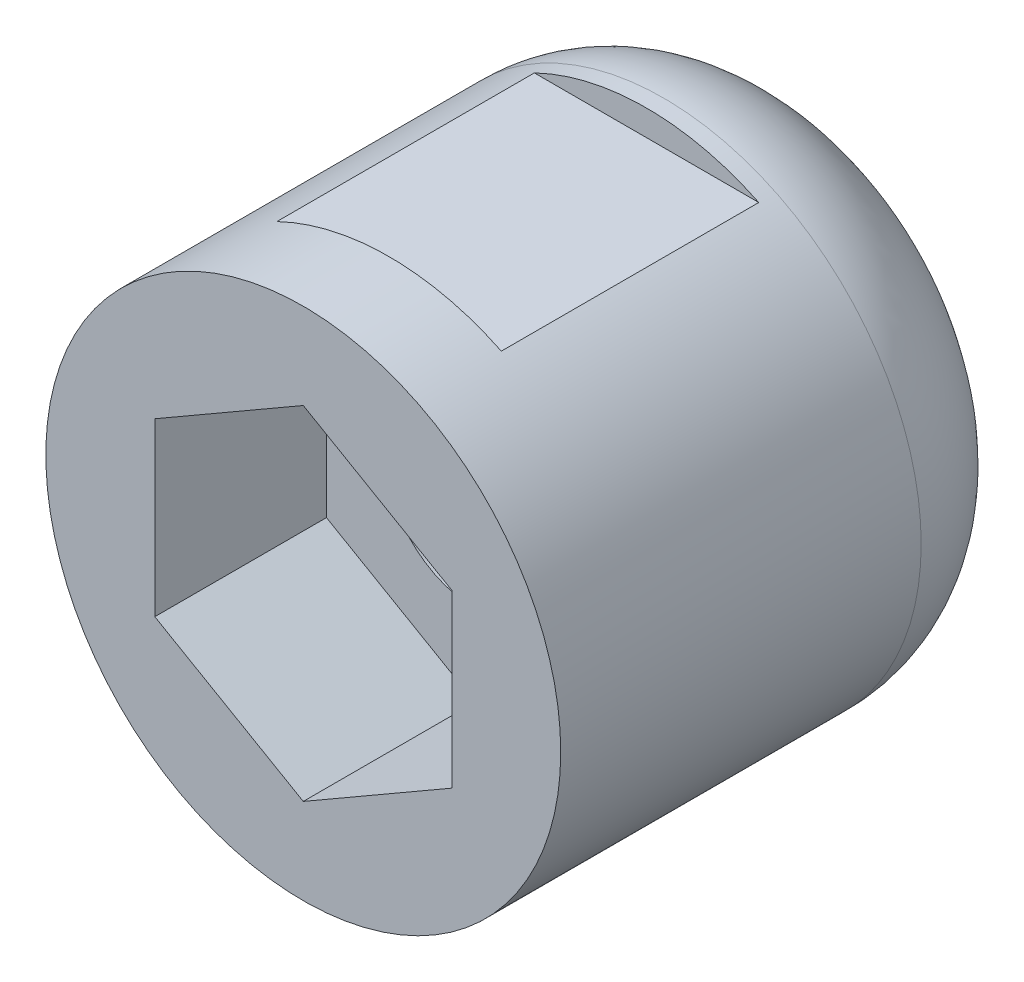
ISO-10303-21;
HEADER;
FILE_DESCRIPTION(('STEP AP214'),'2;1');
FILE_NAME('part.step','',(''),(''),'','','');
FILE_SCHEMA(('AUTOMOTIVE_DESIGN { 1 0 10303 214 1 1 1 1 }'));
ENDSEC;
DATA;
#1=APPLICATION_CONTEXT('core data for automotive mechanical design processes');
#2=APPLICATION_PROTOCOL_DEFINITION('international standard','automotive_design',2000,#1);
#3=PRODUCT_CONTEXT('',#1,'mechanical');
#4=PRODUCT('Part','Part','',(#3));
#5=PRODUCT_RELATED_PRODUCT_CATEGORY('part','',(#4));
#6=PRODUCT_DEFINITION_FORMATION('','',#4);
#7=PRODUCT_DEFINITION_CONTEXT('part definition',#1,'design');
#8=PRODUCT_DEFINITION('design','',#6,#7);
#9=PRODUCT_DEFINITION_SHAPE('','',#8);
#10=(LENGTH_UNIT() NAMED_UNIT(*) SI_UNIT(.MILLI.,.METRE.));
#11=(NAMED_UNIT(*) PLANE_ANGLE_UNIT() SI_UNIT($,.RADIAN.));
#12=(NAMED_UNIT(*) SI_UNIT($,.STERADIAN.) SOLID_ANGLE_UNIT());
#13=UNCERTAINTY_MEASURE_WITH_UNIT(LENGTH_MEASURE(1.E-05),#10,'distance_accuracy_value','');
#14=(GEOMETRIC_REPRESENTATION_CONTEXT(3) GLOBAL_UNCERTAINTY_ASSIGNED_CONTEXT((#13)) GLOBAL_UNIT_ASSIGNED_CONTEXT((#10,
#11,#12)) REPRESENTATION_CONTEXT('',''));
#15=CARTESIAN_POINT('',(0.,0.,0.));
#16=DIRECTION('',(0.,0.,1.));
#17=DIRECTION('',(1.,0.,0.));
#18=AXIS2_PLACEMENT_3D('',#15,#16,#17);
#19=CARTESIAN_POINT('',(0.,0.,14.5));
#20=DIRECTION('',(0.,0.,-1.));
#21=DIRECTION('',(-1.,0.,0.));
#22=AXIS2_PLACEMENT_3D('',#19,#20,#21);
#23=CYLINDRICAL_SURFACE('',#22,5.25);
#24=CARTESIAN_POINT('',(0.,0.,-14.5));
#25=DIRECTION('',(0.,0.,1.));
#26=DIRECTION('',(1.,0.,0.));
#27=AXIS2_PLACEMENT_3D('',#24,#25,#26);
#28=CIRCLE('',#27,5.25);
#29=CARTESIAN_POINT('',(-5.25,0.,-14.5));
#30=VERTEX_POINT('',#29);
#31=EDGE_CURVE('E202',#30,#30,#28,.T.);
#32=CARTESIAN_POINT('',(0.,0.,4.5));
#33=DIRECTION('',(0.,0.,1.));
#34=DIRECTION('',(1.,0.,0.));
#35=AXIS2_PLACEMENT_3D('',#32,#33,#34);
#36=CIRCLE('',#35,5.25);
#37=CARTESIAN_POINT('',(-5.25,0.,4.5));
#38=VERTEX_POINT('',#37);
#39=EDGE_CURVE('E192',#38,#38,#36,.T.);
#40=CARTESIAN_POINT('',(-5.25,0.,-14.5));
#41=CARTESIAN_POINT('',(-5.25,0.,-14.3020833333333));
#42=CARTESIAN_POINT('',(-5.25,0.,-14.1041666666667));
#43=CARTESIAN_POINT('',(-5.25,0.,-13.7083333333333));
#44=CARTESIAN_POINT('',(-5.25,0.,-13.5104166666667));
#45=CARTESIAN_POINT('',(-5.25,0.,-13.1145833333333));
#46=CARTESIAN_POINT('',(-5.25,0.,-12.9166666666667));
#47=CARTESIAN_POINT('',(-5.25,0.,-12.5208333333333));
#48=CARTESIAN_POINT('',(-5.25,0.,-12.3229166666667));
#49=CARTESIAN_POINT('',(-5.25,0.,-11.9270833333333));
#50=CARTESIAN_POINT('',(-5.25,0.,-11.7291666666667));
#51=CARTESIAN_POINT('',(-5.25,0.,-11.3333333333333));
#52=CARTESIAN_POINT('',(-5.25,0.,-11.1354166666667));
#53=CARTESIAN_POINT('',(-5.25,0.,-10.7395833333333));
#54=CARTESIAN_POINT('',(-5.25,0.,-10.5416666666667));
#55=CARTESIAN_POINT('',(-5.25,0.,-10.1458333333333));
#56=CARTESIAN_POINT('',(-5.25,0.,-9.94791666666667));
#57=CARTESIAN_POINT('',(-5.25,0.,-9.55208333333333));
#58=CARTESIAN_POINT('',(-5.25,0.,-9.35416666666667));
#59=CARTESIAN_POINT('',(-5.25,0.,-8.95833333333333));
#60=CARTESIAN_POINT('',(-5.25,0.,-8.76041666666667));
#61=CARTESIAN_POINT('',(-5.25,0.,-8.36458333333333));
#62=CARTESIAN_POINT('',(-5.25,0.,-8.16666666666667));
#63=CARTESIAN_POINT('',(-5.25,0.,-7.77083333333333));
#64=CARTESIAN_POINT('',(-5.25,0.,-7.57291666666667));
#65=CARTESIAN_POINT('',(-5.25,0.,-7.17708333333333));
#66=CARTESIAN_POINT('',(-5.25,0.,-6.97916666666667));
#67=CARTESIAN_POINT('',(-5.25,0.,-6.58333333333333));
#68=CARTESIAN_POINT('',(-5.25,0.,-6.38541666666667));
#69=CARTESIAN_POINT('',(-5.25,0.,-5.98958333333333));
#70=CARTESIAN_POINT('',(-5.25,0.,-5.79166666666667));
#71=CARTESIAN_POINT('',(-5.25,0.,-5.39583333333333));
#72=CARTESIAN_POINT('',(-5.25,0.,-5.19791666666667));
#73=CARTESIAN_POINT('',(-5.25,0.,-4.80208333333333));
#74=CARTESIAN_POINT('',(-5.25,0.,-4.60416666666667));
#75=CARTESIAN_POINT('',(-5.25,0.,-4.20833333333333));
#76=CARTESIAN_POINT('',(-5.25,0.,-4.01041666666666));
#77=CARTESIAN_POINT('',(-5.25,0.,-3.61458333333333));
#78=CARTESIAN_POINT('',(-5.25,0.,-3.41666666666667));
#79=CARTESIAN_POINT('',(-5.25,0.,-3.02083333333333));
#80=CARTESIAN_POINT('',(-5.25,0.,-2.82291666666667));
#81=CARTESIAN_POINT('',(-5.25,0.,-2.42708333333333));
#82=CARTESIAN_POINT('',(-5.25,0.,-2.22916666666667));
#83=CARTESIAN_POINT('',(-5.25,0.,-1.83333333333333));
#84=CARTESIAN_POINT('',(-5.25,0.,-1.63541666666667));
#85=CARTESIAN_POINT('',(-5.25,0.,-1.23958333333333));
#86=CARTESIAN_POINT('',(-5.25,0.,-1.04166666666667));
#87=CARTESIAN_POINT('',(-5.25,0.,-0.645833333333334));
#88=CARTESIAN_POINT('',(-5.25,0.,-0.447916666666667));
#89=CARTESIAN_POINT('',(-5.25,0.,-0.0520833333333334));
#90=CARTESIAN_POINT('',(-5.25,0.,0.145833333333333));
#91=CARTESIAN_POINT('',(-5.25,0.,0.541666666666667));
#92=CARTESIAN_POINT('',(-5.25,0.,0.739583333333334));
#93=CARTESIAN_POINT('',(-5.25,0.,1.13541666666667));
#94=CARTESIAN_POINT('',(-5.25,0.,1.33333333333333));
#95=CARTESIAN_POINT('',(-5.25,0.,1.72916666666667));
#96=CARTESIAN_POINT('',(-5.25,0.,1.92708333333333));
#97=CARTESIAN_POINT('',(-5.25,0.,2.32291666666667));
#98=CARTESIAN_POINT('',(-5.25,0.,2.52083333333333));
#99=CARTESIAN_POINT('',(-5.25,0.,2.91666666666667));
#100=CARTESIAN_POINT('',(-5.25,0.,3.11458333333333));
#101=CARTESIAN_POINT('',(-5.25,0.,3.51041666666667));
#102=CARTESIAN_POINT('',(-5.25,0.,3.70833333333333));
#103=CARTESIAN_POINT('',(-5.25,0.,4.10416666666667));
#104=CARTESIAN_POINT('',(-5.25,0.,4.30208333333333));
#105=CARTESIAN_POINT('',(-5.25,0.,4.5));
#106=B_SPLINE_CURVE_WITH_KNOTS('',3,(#40,#41,#42,#43,#44,#45,#46,#47,#48,#49,#50,#51,#52,#53,
#54,#55,#56,#57,#58,#59,#60,#61,#62,#63,#64,#65,#66,#67,#68,#69,#70,#71,#72,#73,#74,#75,#76,#77,
#78,#79,#80,#81,#82,#83,#84,#85,#86,#87,#88,#89,#90,#91,#92,#93,#94,#95,#96,#97,#98,#99,#100,
#101,#102,#103,#104,#105),.UNSPECIFIED.,.F.,.F.,(4,2,2,2,2,2,2,2,2,2,2,2,2,2,2,2,2,2,2,2,2,2,2,
2,2,2,2,2,2,2,2,2,4),(0.,0.593750000000001,1.1875,1.78125,2.375,2.96875,3.5625,4.15625,4.75,
5.34375,5.9375,6.53125,7.125,7.71875,8.3125,8.90625,9.5,10.09375,10.6875,11.28125,11.875,
12.46875,13.0625,13.65625,14.25,14.84375,15.4375,16.03125,16.625,17.21875,17.8125,18.40625,19.),.UNSPECIFIED.);
#107=EDGE_CURVE('BSEAM35',#30,#38,#106,.T.);
#108=ORIENTED_EDGE('',*,*,#31,.F.);
#109=ORIENTED_EDGE('',*,*,#39,.T.);
#110=ORIENTED_EDGE('',*,*,#107,.T.);
#111=ORIENTED_EDGE('',*,*,#107,.F.);
#112=EDGE_LOOP('',(#108,#110,#109,#111));
#113=FACE_BOUND('',#112,.T.);
#114=ADVANCED_FACE('F35',(#113),#23,.F.);
#115=CARTESIAN_POINT('',(0.,0.,14.5));
#116=DIRECTION('',(0.,0.,1.));
#117=DIRECTION('',(1.,0.,0.));
#118=AXIS2_PLACEMENT_3D('',#115,#116,#117);
#119=PLANE('',#118);
#120=DIRECTION('',(-0.866025403784439,0.5,0.));
#121=VECTOR('',#120,1.);
#122=CARTESIAN_POINT('',(8.65,4.99407982849026,14.5));
#123=LINE('',#122,#121);
#124=CARTESIAN_POINT('',(8.65,4.99407982849026,14.5));
#125=VERTEX_POINT('',#124);
#126=CARTESIAN_POINT('',(0.,9.98815965698052,14.5));
#127=VERTEX_POINT('',#126);
#128=EDGE_CURVE('E57',#125,#127,#123,.T.);
#129=ORIENTED_EDGE('',*,*,#128,.F.);
#130=DIRECTION('',(0.,1.,0.));
#131=VECTOR('',#130,1.);
#132=CARTESIAN_POINT('',(8.65,-4.99407982849027,14.5));
#133=LINE('',#132,#131);
#134=CARTESIAN_POINT('',(8.65,-4.99407982849027,14.5));
#135=VERTEX_POINT('',#134);
#136=EDGE_CURVE('E161',#135,#125,#133,.T.);
#137=ORIENTED_EDGE('',*,*,#136,.F.);
#138=DIRECTION('',(0.866025403784439,0.5,0.));
#139=VECTOR('',#138,1.);
#140=CARTESIAN_POINT('',(0.,-9.98815965698053,14.5));
#141=LINE('',#140,#139);
#142=CARTESIAN_POINT('',(0.,-9.98815965698053,14.5));
#143=VERTEX_POINT('',#142);
#144=EDGE_CURVE('E185',#143,#135,#141,.T.);
#145=ORIENTED_EDGE('',*,*,#144,.F.);
#146=DIRECTION('',(0.866025403784439,-0.5,0.));
#147=VECTOR('',#146,1.);
#148=CARTESIAN_POINT('',(-8.65,-4.99407982849026,14.5));
#149=LINE('',#148,#147);
#150=CARTESIAN_POINT('',(-8.65,-4.99407982849026,14.5));
#151=VERTEX_POINT('',#150);
#152=EDGE_CURVE('E182',#151,#143,#149,.T.);
#153=ORIENTED_EDGE('',*,*,#152,.F.);
#154=DIRECTION('',(0.,-1.,0.));
#155=VECTOR('',#154,1.);
#156=CARTESIAN_POINT('',(-8.65,4.99407982849027,14.5));
#157=LINE('',#156,#155);
#158=CARTESIAN_POINT('',(-8.65,4.99407982849027,14.5));
#159=VERTEX_POINT('',#158);
#160=EDGE_CURVE('E179',#159,#151,#157,.T.);
#161=ORIENTED_EDGE('',*,*,#160,.F.);
#162=DIRECTION('',(-0.866025403784439,-0.5,0.));
#163=VECTOR('',#162,1.);
#164=CARTESIAN_POINT('',(0.,9.98815965698053,14.5));
#165=LINE('',#164,#163);
#166=EDGE_CURVE('E152',#127,#159,#165,.T.);
#167=ORIENTED_EDGE('',*,*,#166,.F.);
#168=EDGE_LOOP('',(#129,#137,#145,#153,#161,#167));
#169=FACE_BOUND('',#168,.T.);
#170=CARTESIAN_POINT('',(0.,0.,14.5));
#171=DIRECTION('',(0.,0.,1.));
#172=DIRECTION('',(1.,0.,0.));
#173=AXIS2_PLACEMENT_3D('',#170,#171,#172);
#174=CIRCLE('',#173,15.);
#175=CARTESIAN_POINT('',(15.,0.,14.5));
#176=VERTEX_POINT('',#175);
#177=EDGE_CURVE('E205',#176,#176,#174,.T.);
#178=ORIENTED_EDGE('',*,*,#177,.T.);
#179=EDGE_LOOP('',(#178));
#180=FACE_BOUND('',#179,.T.);
#181=ADVANCED_FACE('F227',(#169,#180),#119,.T.);
#182=CARTESIAN_POINT('',(0.,0.,-14.5));
#183=DIRECTION('',(0.,0.,1.));
#184=DIRECTION('',(1.,0.,0.));
#185=AXIS2_PLACEMENT_3D('',#182,#183,#184);
#186=PLANE('',#185);
#187=CARTESIAN_POINT('',(0.,0.,-14.5));
#188=DIRECTION('',(0.,0.,1.));
#189=DIRECTION('',(1.,0.,0.));
#190=AXIS2_PLACEMENT_3D('',#187,#188,#189);
#191=CIRCLE('',#190,7.);
#192=CARTESIAN_POINT('',(7.,0.,-14.5));
#193=VERTEX_POINT('',#192);
#194=EDGE_CURVE('E120',#193,#193,#191,.F.);
#195=ORIENTED_EDGE('',*,*,#194,.T.);
#196=EDGE_LOOP('',(#195));
#197=FACE_BOUND('',#196,.T.);
#198=ORIENTED_EDGE('',*,*,#31,.T.);
#199=EDGE_LOOP('',(#198));
#200=FACE_BOUND('',#199,.T.);
#201=ADVANCED_FACE('F215',(#197,#200),#186,.F.);
#202=CARTESIAN_POINT('',(0.,0.,14.5));
#203=DIRECTION('',(0.,0.,-1.));
#204=DIRECTION('',(-1.,0.,0.));
#205=AXIS2_PLACEMENT_3D('',#202,#203,#204);
#206=CYLINDRICAL_SURFACE('',#205,15.);
#207=DIRECTION('',(0.,0.,-1.));
#208=VECTOR('',#207,1.);
#209=CARTESIAN_POINT('',(-6.53834841531101,13.5,14.5));
#210=LINE('',#209,#208);
#211=CARTESIAN_POINT('',(-6.53834841531101,13.5,9.50000000000001));
#212=VERTEX_POINT('',#211);
#213=CARTESIAN_POINT('',(-6.53834841531101,13.5,-5.49999999999999));
#214=VERTEX_POINT('',#213);
#215=EDGE_CURVE('E43',#212,#214,#210,.T.);
#216=ORIENTED_EDGE('',*,*,#215,.T.);
#217=CARTESIAN_POINT('',(0.,0.,-5.5));
#218=DIRECTION('',(0.,0.,-1.));
#219=DIRECTION('',(-1.,0.,0.));
#220=AXIS2_PLACEMENT_3D('',#217,#218,#219);
#221=CIRCLE('',#220,15.);
#222=CARTESIAN_POINT('',(6.53834841531101,13.5,-5.49999999999999));
#223=VERTEX_POINT('',#222);
#224=EDGE_CURVE('E11',#214,#223,#221,.T.);
#225=ORIENTED_EDGE('',*,*,#224,.T.);
#226=DIRECTION('',(0.,0.,-1.));
#227=VECTOR('',#226,1.);
#228=CARTESIAN_POINT('',(6.53834841531101,13.5,14.5));
#229=LINE('',#228,#227);
#230=CARTESIAN_POINT('',(6.53834841531101,13.5,9.50000000000001));
#231=VERTEX_POINT('',#230);
#232=EDGE_CURVE('E141',#223,#231,#229,.F.);
#233=ORIENTED_EDGE('',*,*,#232,.T.);
#234=CARTESIAN_POINT('',(0.,0.,9.49999999999999));
#235=DIRECTION('',(0.,0.,1.));
#236=DIRECTION('',(0.,-1.,0.));
#237=AXIS2_PLACEMENT_3D('',#234,#235,#236);
#238=CIRCLE('',#237,15.);
#239=EDGE_CURVE('E138',#231,#212,#238,.T.);
#240=ORIENTED_EDGE('',*,*,#239,.T.);
#241=EDGE_LOOP('',(#216,#225,#233,#240));
#242=FACE_BOUND('',#241,.T.);
#243=DIRECTION('',(0.,0.,-1.));
#244=VECTOR('',#243,1.);
#245=CARTESIAN_POINT('',(6.53834841531101,-13.5,14.5));
#246=LINE('',#245,#244);
#247=CARTESIAN_POINT('',(6.53834841531101,-13.5,9.50000000000001));
#248=VERTEX_POINT('',#247);
#249=CARTESIAN_POINT('',(6.538348415311,-13.5,-5.49999999999998));
#250=VERTEX_POINT('',#249);
#251=EDGE_CURVE('E126',#248,#250,#246,.T.);
#252=ORIENTED_EDGE('',*,*,#251,.T.);
#253=CARTESIAN_POINT('',(0.,0.,-5.49999999999998));
#254=DIRECTION('',(0.,0.,-1.));
#255=DIRECTION('',(-1.,0.,0.));
#256=AXIS2_PLACEMENT_3D('',#253,#254,#255);
#257=CIRCLE('',#256,15.);
#258=CARTESIAN_POINT('',(-6.538348415311,-13.5,-5.49999999999998));
#259=VERTEX_POINT('',#258);
#260=EDGE_CURVE('E132',#250,#259,#257,.T.);
#261=ORIENTED_EDGE('',*,*,#260,.T.);
#262=DIRECTION('',(0.,0.,-1.));
#263=VECTOR('',#262,1.);
#264=CARTESIAN_POINT('',(-6.53834841531101,-13.5,14.5));
#265=LINE('',#264,#263);
#266=CARTESIAN_POINT('',(-6.53834841531101,-13.5,9.50000000000001));
#267=VERTEX_POINT('',#266);
#268=EDGE_CURVE('E119',#259,#267,#265,.F.);
#269=ORIENTED_EDGE('',*,*,#268,.T.);
#270=CARTESIAN_POINT('',(0.,0.,9.49999999999999));
#271=DIRECTION('',(0.,0.,1.));
#272=DIRECTION('',(0.,-1.,0.));
#273=AXIS2_PLACEMENT_3D('',#270,#271,#272);
#274=CIRCLE('',#273,15.);
#275=EDGE_CURVE('E111',#267,#248,#274,.T.);
#276=ORIENTED_EDGE('',*,*,#275,.T.);
#277=EDGE_LOOP('',(#252,#261,#269,#276));
#278=FACE_BOUND('',#277,.T.);
#279=CARTESIAN_POINT('',(0.,0.,-6.50000000000001));
#280=DIRECTION('',(0.,0.,1.));
#281=DIRECTION('',(1.,0.,0.));
#282=AXIS2_PLACEMENT_3D('',#279,#280,#281);
#283=CIRCLE('',#282,15.);
#284=CARTESIAN_POINT('',(15.,0.,-6.50000000000001));
#285=VERTEX_POINT('',#284);
#286=EDGE_CURVE('E208',#285,#285,#283,.T.);
#287=ORIENTED_EDGE('',*,*,#286,.T.);
#288=EDGE_LOOP('',(#287));
#289=FACE_BOUND('',#288,.T.);
#290=ORIENTED_EDGE('',*,*,#177,.F.);
#291=EDGE_LOOP('',(#290));
#292=FACE_BOUND('',#291,.T.);
#293=ADVANCED_FACE('F130',(#242,#278,#289,#292),#206,.T.);
#294=CARTESIAN_POINT('',(8.65,4.99407982849026,4.5));
#295=DIRECTION('',(0.5,0.866025403784439,0.));
#296=DIRECTION('',(-0.866025403784439,0.5,0.));
#297=AXIS2_PLACEMENT_3D('',#294,#295,#296);
#298=PLANE('',#297);
#299=ORIENTED_EDGE('',*,*,#128,.T.);
#300=DIRECTION('',(0.,0.,1.));
#301=VECTOR('',#300,1.);
#302=CARTESIAN_POINT('',(0.,9.98815965698053,4.5));
#303=LINE('',#302,#301);
#304=CARTESIAN_POINT('',(0.,9.98815965698053,4.5));
#305=VERTEX_POINT('',#304);
#306=EDGE_CURVE('E175',#305,#127,#303,.T.);
#307=ORIENTED_EDGE('',*,*,#306,.F.);
#308=DIRECTION('',(-0.866025403784439,0.5,0.));
#309=VECTOR('',#308,1.);
#310=CARTESIAN_POINT('',(8.65,4.99407982849026,4.5));
#311=LINE('',#310,#309);
#312=CARTESIAN_POINT('',(8.65,4.99407982849026,4.5));
#313=VERTEX_POINT('',#312);
#314=EDGE_CURVE('E157',#313,#305,#311,.T.);
#315=ORIENTED_EDGE('',*,*,#314,.F.);
#316=DIRECTION('',(0.,0.,1.));
#317=VECTOR('',#316,1.);
#318=CARTESIAN_POINT('',(8.65,4.99407982849026,4.5));
#319=LINE('',#318,#317);
#320=EDGE_CURVE('E190',#313,#125,#319,.T.);
#321=ORIENTED_EDGE('',*,*,#320,.T.);
#322=EDGE_LOOP('',(#299,#307,#315,#321));
#323=FACE_BOUND('',#322,.T.);
#324=ADVANCED_FACE('F224',(#323),#298,.F.);
#325=CARTESIAN_POINT('',(8.65,-4.99407982849027,4.5));
#326=DIRECTION('',(1.,0.,0.));
#327=DIRECTION('',(0.,0.,-1.));
#328=AXIS2_PLACEMENT_3D('',#325,#326,#327);
#329=PLANE('',#328);
#330=ORIENTED_EDGE('',*,*,#136,.T.);
#331=ORIENTED_EDGE('',*,*,#320,.F.);
#332=DIRECTION('',(0.,1.,0.));
#333=VECTOR('',#332,1.);
#334=CARTESIAN_POINT('',(8.65,-4.99407982849027,4.5));
#335=LINE('',#334,#333);
#336=CARTESIAN_POINT('',(8.65,-4.99407982849027,4.5));
#337=VERTEX_POINT('',#336);
#338=EDGE_CURVE('E173',#337,#313,#335,.T.);
#339=ORIENTED_EDGE('',*,*,#338,.F.);
#340=DIRECTION('',(0.,0.,1.));
#341=VECTOR('',#340,1.);
#342=CARTESIAN_POINT('',(8.65,-4.99407982849027,4.5));
#343=LINE('',#342,#341);
#344=EDGE_CURVE('E193',#337,#135,#343,.T.);
#345=ORIENTED_EDGE('',*,*,#344,.T.);
#346=EDGE_LOOP('',(#330,#331,#339,#345));
#347=FACE_BOUND('',#346,.T.);
#348=ADVANCED_FACE('F241',(#347),#329,.F.);
#349=CARTESIAN_POINT('',(0.,-9.98815965698053,4.5));
#350=DIRECTION('',(0.5,-0.866025403784439,0.));
#351=DIRECTION('',(0.866025403784439,0.5,0.));
#352=AXIS2_PLACEMENT_3D('',#349,#350,#351);
#353=PLANE('',#352);
#354=ORIENTED_EDGE('',*,*,#144,.T.);
#355=ORIENTED_EDGE('',*,*,#344,.F.);
#356=DIRECTION('',(0.866025403784439,0.5,0.));
#357=VECTOR('',#356,1.);
#358=CARTESIAN_POINT('',(0.,-9.98815965698053,4.5));
#359=LINE('',#358,#357);
#360=CARTESIAN_POINT('',(0.,-9.98815965698053,4.5));
#361=VERTEX_POINT('',#360);
#362=EDGE_CURVE('E170',#361,#337,#359,.T.);
#363=ORIENTED_EDGE('',*,*,#362,.F.);
#364=DIRECTION('',(0.,0.,1.));
#365=VECTOR('',#364,1.);
#366=CARTESIAN_POINT('',(0.,-9.98815965698053,4.5));
#367=LINE('',#366,#365);
#368=EDGE_CURVE('E195',#361,#143,#367,.T.);
#369=ORIENTED_EDGE('',*,*,#368,.T.);
#370=EDGE_LOOP('',(#354,#355,#363,#369));
#371=FACE_BOUND('',#370,.T.);
#372=ADVANCED_FACE('F253',(#371),#353,.F.);
#373=CARTESIAN_POINT('',(-8.65,-4.99407982849026,4.5));
#374=DIRECTION('',(-0.5,-0.866025403784439,0.));
#375=DIRECTION('',(0.866025403784439,-0.5,0.));
#376=AXIS2_PLACEMENT_3D('',#373,#374,#375);
#377=PLANE('',#376);
#378=ORIENTED_EDGE('',*,*,#152,.T.);
#379=ORIENTED_EDGE('',*,*,#368,.F.);
#380=DIRECTION('',(0.866025403784439,-0.5,0.));
#381=VECTOR('',#380,1.);
#382=CARTESIAN_POINT('',(-8.65,-4.99407982849026,4.5));
#383=LINE('',#382,#381);
#384=CARTESIAN_POINT('',(-8.65,-4.99407982849026,4.5));
#385=VERTEX_POINT('',#384);
#386=EDGE_CURVE('E167',#385,#361,#383,.T.);
#387=ORIENTED_EDGE('',*,*,#386,.F.);
#388=DIRECTION('',(0.,0.,1.));
#389=VECTOR('',#388,1.);
#390=CARTESIAN_POINT('',(-8.65,-4.99407982849026,4.5));
#391=LINE('',#390,#389);
#392=EDGE_CURVE('E197',#385,#151,#391,.T.);
#393=ORIENTED_EDGE('',*,*,#392,.T.);
#394=EDGE_LOOP('',(#378,#379,#387,#393));
#395=FACE_BOUND('',#394,.T.);
#396=ADVANCED_FACE('F249',(#395),#377,.F.);
#397=CARTESIAN_POINT('',(-8.65,4.99407982849027,4.5));
#398=DIRECTION('',(-1.,0.,0.));
#399=DIRECTION('',(0.,0.,1.));
#400=AXIS2_PLACEMENT_3D('',#397,#398,#399);
#401=PLANE('',#400);
#402=ORIENTED_EDGE('',*,*,#160,.T.);
#403=ORIENTED_EDGE('',*,*,#392,.F.);
#404=DIRECTION('',(0.,-1.,0.));
#405=VECTOR('',#404,1.);
#406=CARTESIAN_POINT('',(-8.65,4.99407982849027,4.5));
#407=LINE('',#406,#405);
#408=CARTESIAN_POINT('',(-8.65,4.99407982849027,4.5));
#409=VERTEX_POINT('',#408);
#410=EDGE_CURVE('E164',#409,#385,#407,.T.);
#411=ORIENTED_EDGE('',*,*,#410,.F.);
#412=DIRECTION('',(0.,0.,1.));
#413=VECTOR('',#412,1.);
#414=CARTESIAN_POINT('',(-8.65,4.99407982849027,4.5));
#415=LINE('',#414,#413);
#416=EDGE_CURVE('E199',#409,#159,#415,.T.);
#417=ORIENTED_EDGE('',*,*,#416,.T.);
#418=EDGE_LOOP('',(#402,#403,#411,#417));
#419=FACE_BOUND('',#418,.T.);
#420=ADVANCED_FACE('F245',(#419),#401,.F.);
#421=CARTESIAN_POINT('',(0.,9.98815965698053,4.5));
#422=DIRECTION('',(-0.5,0.866025403784439,0.));
#423=DIRECTION('',(-0.866025403784439,-0.5,0.));
#424=AXIS2_PLACEMENT_3D('',#421,#422,#423);
#425=PLANE('',#424);
#426=ORIENTED_EDGE('',*,*,#166,.T.);
#427=ORIENTED_EDGE('',*,*,#416,.F.);
#428=DIRECTION('',(-0.866025403784439,-0.5,0.));
#429=VECTOR('',#428,1.);
#430=CARTESIAN_POINT('',(0.,9.98815965698053,4.5));
#431=LINE('',#430,#429);
#432=EDGE_CURVE('E160',#305,#409,#431,.T.);
#433=ORIENTED_EDGE('',*,*,#432,.F.);
#434=ORIENTED_EDGE('',*,*,#306,.T.);
#435=EDGE_LOOP('',(#426,#427,#433,#434));
#436=FACE_BOUND('',#435,.T.);
#437=ADVANCED_FACE('F242',(#436),#425,.F.);
#438=CARTESIAN_POINT('',(0.,0.,4.5));
#439=DIRECTION('',(0.,0.,1.));
#440=DIRECTION('',(1.,0.,0.));
#441=AXIS2_PLACEMENT_3D('',#438,#439,#440);
#442=PLANE('',#441);
#443=ORIENTED_EDGE('',*,*,#39,.F.);
#444=EDGE_LOOP('',(#443));
#445=FACE_BOUND('',#444,.T.);
#446=ORIENTED_EDGE('',*,*,#314,.T.);
#447=ORIENTED_EDGE('',*,*,#432,.T.);
#448=ORIENTED_EDGE('',*,*,#410,.T.);
#449=ORIENTED_EDGE('',*,*,#386,.T.);
#450=ORIENTED_EDGE('',*,*,#362,.T.);
#451=ORIENTED_EDGE('',*,*,#338,.T.);
#452=EDGE_LOOP('',(#446,#447,#448,#449,#450,#451));
#453=FACE_BOUND('',#452,.T.);
#454=ADVANCED_FACE('F220',(#445,#453),#442,.T.);
#455=CARTESIAN_POINT('',(0.,0.,-6.5));
#456=DIRECTION('',(0.,0.,1.));
#457=DIRECTION('',(1.,0.,0.));
#458=AXIS2_PLACEMENT_3D('',#455,#456,#457);
#459=DEGENERATE_TOROIDAL_SURFACE('',#458,7.,8.,.T.);
#460=ORIENTED_EDGE('',*,*,#194,.F.);
#461=EDGE_LOOP('',(#460));
#462=FACE_BOUND('',#461,.T.);
#463=ORIENTED_EDGE('',*,*,#286,.F.);
#464=EDGE_LOOP('',(#463));
#465=FACE_BOUND('',#464,.T.);
#466=ADVANCED_FACE('F37',(#462,#465),#459,.T.);
#467=CARTESIAN_POINT('',(-15.,-13.5,9.50000000000001));
#468=DIRECTION('',(0.,1.,0.));
#469=DIRECTION('',(0.,0.,1.));
#470=AXIS2_PLACEMENT_3D('',#467,#468,#469);
#471=PLANE('',#470);
#472=DIRECTION('',(1.,0.,0.));
#473=VECTOR('',#472,1.);
#474=CARTESIAN_POINT('',(-15.,-13.5,9.50000000000001));
#475=LINE('',#474,#473);
#476=EDGE_CURVE('E114',#267,#248,#475,.T.);
#477=ORIENTED_EDGE('',*,*,#476,.F.);
#478=ORIENTED_EDGE('',*,*,#268,.F.);
#479=DIRECTION('',(1.,0.,0.));
#480=VECTOR('',#479,1.);
#481=CARTESIAN_POINT('',(-15.,-13.5,-5.49999999999998));
#482=LINE('',#481,#480);
#483=EDGE_CURVE('E127',#259,#250,#482,.T.);
#484=ORIENTED_EDGE('',*,*,#483,.T.);
#485=ORIENTED_EDGE('',*,*,#251,.F.);
#486=EDGE_LOOP('',(#477,#478,#484,#485));
#487=FACE_BOUND('',#486,.T.);
#488=ADVANCED_FACE('F123',(#487),#471,.F.);
#489=CARTESIAN_POINT('',(-15.,-13.5,-5.49999999999998));
#490=DIRECTION('',(0.,0.,-1.));
#491=DIRECTION('',(-1.,0.,0.));
#492=AXIS2_PLACEMENT_3D('',#489,#490,#491);
#493=PLANE('',#492);
#494=ORIENTED_EDGE('',*,*,#483,.F.);
#495=ORIENTED_EDGE('',*,*,#260,.F.);
#496=EDGE_LOOP('',(#494,#495));
#497=FACE_BOUND('',#496,.T.);
#498=ADVANCED_FACE('F266',(#497),#493,.F.);
#499=CARTESIAN_POINT('',(-15.,-15.,9.50000000000001));
#500=DIRECTION('',(0.,0.,1.));
#501=DIRECTION('',(0.,-1.,0.));
#502=AXIS2_PLACEMENT_3D('',#499,#500,#501);
#503=PLANE('',#502);
#504=ORIENTED_EDGE('',*,*,#275,.F.);
#505=ORIENTED_EDGE('',*,*,#476,.T.);
#506=EDGE_LOOP('',(#504,#505));
#507=FACE_BOUND('',#506,.T.);
#508=ADVANCED_FACE('F113',(#507),#503,.F.);
#509=CARTESIAN_POINT('',(-15.,13.5,-5.49999999999999));
#510=DIRECTION('',(0.,0.,-1.));
#511=DIRECTION('',(-1.,0.,0.));
#512=AXIS2_PLACEMENT_3D('',#509,#510,#511);
#513=PLANE('',#512);
#514=DIRECTION('',(1.,0.,0.));
#515=VECTOR('',#514,1.);
#516=CARTESIAN_POINT('',(-15.,13.5,-5.49999999999999));
#517=LINE('',#516,#515);
#518=EDGE_CURVE('E149',#214,#223,#517,.T.);
#519=ORIENTED_EDGE('',*,*,#518,.T.);
#520=ORIENTED_EDGE('',*,*,#224,.F.);
#521=EDGE_LOOP('',(#519,#520));
#522=FACE_BOUND('',#521,.T.);
#523=ADVANCED_FACE('F269',(#522),#513,.F.);
#524=CARTESIAN_POINT('',(-15.,13.5,9.50000000000001));
#525=DIRECTION('',(0.,-1.,0.));
#526=DIRECTION('',(0.,0.,-1.));
#527=AXIS2_PLACEMENT_3D('',#524,#525,#526);
#528=PLANE('',#527);
#529=DIRECTION('',(1.,0.,0.));
#530=VECTOR('',#529,1.);
#531=CARTESIAN_POINT('',(-15.,13.5,9.50000000000001));
#532=LINE('',#531,#530);
#533=EDGE_CURVE('E49',#212,#231,#532,.T.);
#534=ORIENTED_EDGE('',*,*,#533,.T.);
#535=ORIENTED_EDGE('',*,*,#232,.F.);
#536=ORIENTED_EDGE('',*,*,#518,.F.);
#537=ORIENTED_EDGE('',*,*,#215,.F.);
#538=EDGE_LOOP('',(#534,#535,#536,#537));
#539=FACE_BOUND('',#538,.T.);
#540=ADVANCED_FACE('F147',(#539),#528,.F.);
#541=CARTESIAN_POINT('',(-15.,15.,9.50000000000001));
#542=DIRECTION('',(0.,0.,1.));
#543=DIRECTION('',(0.,-1.,0.));
#544=AXIS2_PLACEMENT_3D('',#541,#542,#543);
#545=PLANE('',#544);
#546=ORIENTED_EDGE('',*,*,#533,.F.);
#547=ORIENTED_EDGE('',*,*,#239,.F.);
#548=EDGE_LOOP('',(#546,#547));
#549=FACE_BOUND('',#548,.T.);
#550=ADVANCED_FACE('F273',(#549),#545,.F.);
#551=CLOSED_SHELL('',(#114,#181,#201,#293,#324,#348,#372,#396,#420,#437,#454,#466,#488,#498,
#508,#523,#540,#550));
#552=MANIFOLD_SOLID_BREP('B2',#551);
#553=ADVANCED_BREP_SHAPE_REPRESENTATION('',(#18,#552),#14);
#554=SHAPE_DEFINITION_REPRESENTATION(#9,#553);
ENDSEC;
END-ISO-10303-21;
